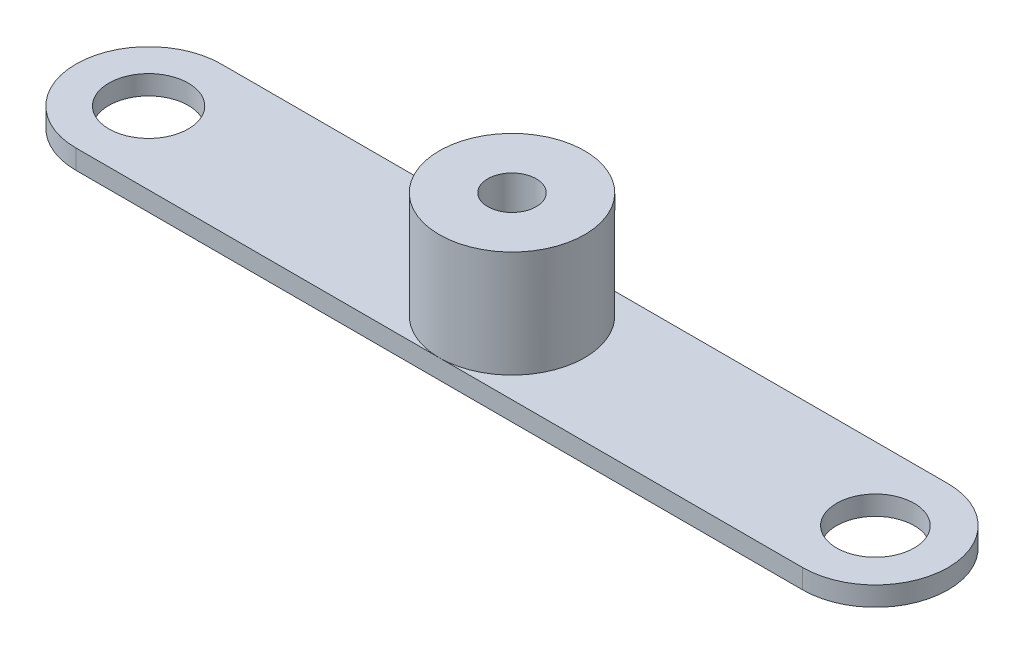
ISO-10303-21;
HEADER;
FILE_DESCRIPTION(('STEP AP214'),'2;1');
FILE_NAME('part.step','',(''),(''),'','','');
FILE_SCHEMA(('AUTOMOTIVE_DESIGN { 1 0 10303 214 1 1 1 1 }'));
ENDSEC;
DATA;
#1=APPLICATION_CONTEXT('core data for automotive mechanical design processes');
#2=APPLICATION_PROTOCOL_DEFINITION('international standard','automotive_design',2000,#1);
#3=PRODUCT_CONTEXT('',#1,'mechanical');
#4=PRODUCT('Part','Part','',(#3));
#5=PRODUCT_RELATED_PRODUCT_CATEGORY('part','',(#4));
#6=PRODUCT_DEFINITION_FORMATION('','',#4);
#7=PRODUCT_DEFINITION_CONTEXT('part definition',#1,'design');
#8=PRODUCT_DEFINITION('design','',#6,#7);
#9=PRODUCT_DEFINITION_SHAPE('','',#8);
#10=(LENGTH_UNIT() NAMED_UNIT(*) SI_UNIT(.MILLI.,.METRE.));
#11=(NAMED_UNIT(*) PLANE_ANGLE_UNIT() SI_UNIT($,.RADIAN.));
#12=(NAMED_UNIT(*) SI_UNIT($,.STERADIAN.) SOLID_ANGLE_UNIT());
#13=UNCERTAINTY_MEASURE_WITH_UNIT(LENGTH_MEASURE(1.E-05),#10,'distance_accuracy_value','');
#14=(GEOMETRIC_REPRESENTATION_CONTEXT(3) GLOBAL_UNCERTAINTY_ASSIGNED_CONTEXT((#13)) GLOBAL_UNIT_ASSIGNED_CONTEXT((#10,
#11,#12)) REPRESENTATION_CONTEXT('',''));
#15=CARTESIAN_POINT('',(0.,0.,0.));
#16=DIRECTION('',(0.,0.,1.));
#17=DIRECTION('',(1.,0.,0.));
#18=AXIS2_PLACEMENT_3D('',#15,#16,#17);
#19=CARTESIAN_POINT('',(-37.5,2.,0.));
#20=DIRECTION('',(0.,1.,0.));
#21=DIRECTION('',(0.,0.,1.));
#22=AXIS2_PLACEMENT_3D('',#19,#20,#21);
#23=PLANE('',#22);
#24=CARTESIAN_POINT('',(0.,2.,0.));
#25=DIRECTION('',(0.,1.,0.));
#26=DIRECTION('',(0.,0.,1.));
#27=AXIS2_PLACEMENT_3D('',#24,#25,#26);
#28=CIRCLE('',#27,7.50000000000001);
#29=CARTESIAN_POINT('',(0.,2.,7.50000000000001));
#30=VERTEX_POINT('',#29);
#31=CARTESIAN_POINT('',(0.,2.,-7.50000000000001));
#32=VERTEX_POINT('',#31);
#33=EDGE_CURVE('E49',#30,#32,#28,.T.);
#34=ORIENTED_EDGE('',*,*,#33,.F.);
#35=DIRECTION('',(1.,0.,0.));
#36=VECTOR('',#35,1.);
#37=CARTESIAN_POINT('',(-37.5,2.,7.5));
#38=LINE('',#37,#36);
#39=CARTESIAN_POINT('',(37.5,2.,7.5));
#40=VERTEX_POINT('',#39);
#41=EDGE_CURVE('E97',#30,#40,#38,.T.);
#42=ORIENTED_EDGE('',*,*,#41,.T.);
#43=CARTESIAN_POINT('',(37.5,2.,0.));
#44=DIRECTION('',(0.,1.,0.));
#45=DIRECTION('',(0.,0.,1.));
#46=AXIS2_PLACEMENT_3D('',#43,#44,#45);
#47=CIRCLE('',#46,7.5);
#48=CARTESIAN_POINT('',(37.5,2.,-7.50000000000001));
#49=VERTEX_POINT('',#48);
#50=EDGE_CURVE('E96',#40,#49,#47,.T.);
#51=ORIENTED_EDGE('',*,*,#50,.T.);
#52=DIRECTION('',(-1.,0.,0.));
#53=VECTOR('',#52,1.);
#54=CARTESIAN_POINT('',(-37.5,2.,-7.5));
#55=LINE('',#54,#53);
#56=EDGE_CURVE('E110',#49,#32,#55,.T.);
#57=ORIENTED_EDGE('',*,*,#56,.T.);
#58=EDGE_LOOP('',(#34,#42,#51,#57));
#59=FACE_BOUND('',#58,.T.);
#60=CARTESIAN_POINT('',(37.5,2.,0.));
#61=DIRECTION('',(0.,1.,0.));
#62=DIRECTION('',(0.,0.,1.));
#63=AXIS2_PLACEMENT_3D('',#60,#61,#62);
#64=CIRCLE('',#63,4.);
#65=CARTESIAN_POINT('',(37.5,2.,4.));
#66=VERTEX_POINT('',#65);
#67=EDGE_CURVE('E181',#66,#66,#64,.T.);
#68=ORIENTED_EDGE('',*,*,#67,.F.);
#69=EDGE_LOOP('',(#68));
#70=FACE_BOUND('',#69,.T.);
#71=ADVANCED_FACE('F39',(#59,#70),#23,.T.);
#72=EDGE_CURVE('E11',#32,#30,#28,.T.);
#73=ORIENTED_EDGE('',*,*,#72,.F.);
#74=CARTESIAN_POINT('',(-37.5,2.,-7.5));
#75=VERTEX_POINT('',#74);
#76=EDGE_CURVE('E59',#32,#75,#55,.T.);
#77=ORIENTED_EDGE('',*,*,#76,.T.);
#78=CARTESIAN_POINT('',(-37.5,2.,0.));
#79=DIRECTION('',(0.,1.,0.));
#80=DIRECTION('',(0.,0.,1.));
#81=AXIS2_PLACEMENT_3D('',#78,#79,#80);
#82=CIRCLE('',#81,7.5);
#83=CARTESIAN_POINT('',(-37.5,2.,7.5));
#84=VERTEX_POINT('',#83);
#85=EDGE_CURVE('E94',#75,#84,#82,.T.);
#86=ORIENTED_EDGE('',*,*,#85,.T.);
#87=EDGE_CURVE('E88',#84,#30,#38,.T.);
#88=ORIENTED_EDGE('',*,*,#87,.T.);
#89=EDGE_LOOP('',(#73,#77,#86,#88));
#90=FACE_BOUND('',#89,.T.);
#91=CARTESIAN_POINT('',(-37.5,2.,0.));
#92=DIRECTION('',(0.,1.,0.));
#93=DIRECTION('',(0.,0.,1.));
#94=AXIS2_PLACEMENT_3D('',#91,#92,#93);
#95=CIRCLE('',#94,4.1);
#96=CARTESIAN_POINT('',(-37.5,2.,4.1));
#97=VERTEX_POINT('',#96);
#98=EDGE_CURVE('E161',#97,#97,#95,.T.);
#99=ORIENTED_EDGE('',*,*,#98,.F.);
#100=EDGE_LOOP('',(#99));
#101=FACE_BOUND('',#100,.T.);
#102=ADVANCED_FACE('F91',(#90,#101),#23,.T.);
#103=CARTESIAN_POINT('',(-37.5,0.,0.));
#104=DIRECTION('',(0.,1.,0.));
#105=DIRECTION('',(0.,0.,1.));
#106=AXIS2_PLACEMENT_3D('',#103,#104,#105);
#107=PLANE('',#106);
#108=CARTESIAN_POINT('',(0.,0.,0.));
#109=DIRECTION('',(0.,1.,0.));
#110=DIRECTION('',(0.,0.,1.));
#111=AXIS2_PLACEMENT_3D('',#108,#109,#110);
#112=CIRCLE('',#111,2.5);
#113=CARTESIAN_POINT('',(0.,0.,2.5));
#114=VERTEX_POINT('',#113);
#115=EDGE_CURVE('E113',#114,#114,#112,.T.);
#116=ORIENTED_EDGE('',*,*,#115,.T.);
#117=EDGE_LOOP('',(#116));
#118=FACE_BOUND('',#117,.T.);
#119=CARTESIAN_POINT('',(-37.5,0.,0.));
#120=DIRECTION('',(0.,1.,0.));
#121=DIRECTION('',(0.,0.,1.));
#122=AXIS2_PLACEMENT_3D('',#119,#120,#121);
#123=CIRCLE('',#122,7.5);
#124=CARTESIAN_POINT('',(-37.5,0.,-7.5));
#125=VERTEX_POINT('',#124);
#126=CARTESIAN_POINT('',(-37.5,0.,7.5));
#127=VERTEX_POINT('',#126);
#128=EDGE_CURVE('E157',#125,#127,#123,.T.);
#129=ORIENTED_EDGE('',*,*,#128,.F.);
#130=DIRECTION('',(-1.,0.,0.));
#131=VECTOR('',#130,1.);
#132=CARTESIAN_POINT('',(-37.5,0.,-7.5));
#133=LINE('',#132,#131);
#134=CARTESIAN_POINT('',(37.5,0.,-7.50000000000001));
#135=VERTEX_POINT('',#134);
#136=EDGE_CURVE('E81',#135,#125,#133,.T.);
#137=ORIENTED_EDGE('',*,*,#136,.F.);
#138=CARTESIAN_POINT('',(37.5,0.,0.));
#139=DIRECTION('',(0.,1.,0.));
#140=DIRECTION('',(0.,0.,1.));
#141=AXIS2_PLACEMENT_3D('',#138,#139,#140);
#142=CIRCLE('',#141,7.5);
#143=CARTESIAN_POINT('',(37.5,0.,7.5));
#144=VERTEX_POINT('',#143);
#145=EDGE_CURVE('E163',#144,#135,#142,.T.);
#146=ORIENTED_EDGE('',*,*,#145,.F.);
#147=DIRECTION('',(1.,0.,0.));
#148=VECTOR('',#147,1.);
#149=CARTESIAN_POINT('',(-37.5,0.,7.5));
#150=LINE('',#149,#148);
#151=EDGE_CURVE('E160',#127,#144,#150,.T.);
#152=ORIENTED_EDGE('',*,*,#151,.F.);
#153=EDGE_LOOP('',(#129,#137,#146,#152));
#154=FACE_BOUND('',#153,.T.);
#155=CARTESIAN_POINT('',(-37.5,0.,0.));
#156=DIRECTION('',(0.,1.,0.));
#157=DIRECTION('',(0.,0.,1.));
#158=AXIS2_PLACEMENT_3D('',#155,#156,#157);
#159=CIRCLE('',#158,4.1);
#160=CARTESIAN_POINT('',(-37.5,0.,4.1));
#161=VERTEX_POINT('',#160);
#162=EDGE_CURVE('E166',#161,#161,#159,.T.);
#163=ORIENTED_EDGE('',*,*,#162,.T.);
#164=EDGE_LOOP('',(#163));
#165=FACE_BOUND('',#164,.T.);
#166=CARTESIAN_POINT('',(37.5,0.,0.));
#167=DIRECTION('',(0.,1.,0.));
#168=DIRECTION('',(0.,0.,1.));
#169=AXIS2_PLACEMENT_3D('',#166,#167,#168);
#170=CIRCLE('',#169,4.);
#171=CARTESIAN_POINT('',(37.5,0.,4.));
#172=VERTEX_POINT('',#171);
#173=EDGE_CURVE('E183',#172,#172,#170,.T.);
#174=ORIENTED_EDGE('',*,*,#173,.T.);
#175=EDGE_LOOP('',(#174));
#176=FACE_BOUND('',#175,.T.);
#177=ADVANCED_FACE('F138',(#118,#154,#165,#176),#107,.F.);
#178=CARTESIAN_POINT('',(-37.5,2.,0.));
#179=DIRECTION('',(0.,-1.,0.));
#180=DIRECTION('',(0.,0.,-1.));
#181=AXIS2_PLACEMENT_3D('',#178,#179,#180);
#182=CYLINDRICAL_SURFACE('',#181,7.5);
#183=ORIENTED_EDGE('',*,*,#128,.T.);
#184=DIRECTION('',(0.,-1.,0.));
#185=VECTOR('',#184,1.);
#186=CARTESIAN_POINT('',(-37.5,2.,7.5));
#187=LINE('',#186,#185);
#188=EDGE_CURVE('E43',#84,#127,#187,.T.);
#189=ORIENTED_EDGE('',*,*,#188,.F.);
#190=ORIENTED_EDGE('',*,*,#85,.F.);
#191=DIRECTION('',(0.,-1.,0.));
#192=VECTOR('',#191,1.);
#193=CARTESIAN_POINT('',(-37.5,2.,-7.5));
#194=LINE('',#193,#192);
#195=EDGE_CURVE('E158',#75,#125,#194,.T.);
#196=ORIENTED_EDGE('',*,*,#195,.T.);
#197=EDGE_LOOP('',(#183,#189,#190,#196));
#198=FACE_BOUND('',#197,.T.);
#199=ADVANCED_FACE('F41',(#198),#182,.T.);
#200=CARTESIAN_POINT('',(-37.5,2.,7.5));
#201=DIRECTION('',(0.,0.,-1.));
#202=DIRECTION('',(-1.,0.,0.));
#203=AXIS2_PLACEMENT_3D('',#200,#201,#202);
#204=PLANE('',#203);
#205=ORIENTED_EDGE('',*,*,#151,.T.);
#206=DIRECTION('',(0.,-1.,0.));
#207=VECTOR('',#206,1.);
#208=CARTESIAN_POINT('',(37.5,2.,7.5));
#209=LINE('',#208,#207);
#210=EDGE_CURVE('E103',#40,#144,#209,.T.);
#211=ORIENTED_EDGE('',*,*,#210,.F.);
#212=ORIENTED_EDGE('',*,*,#41,.F.);
#213=ORIENTED_EDGE('',*,*,#87,.F.);
#214=ORIENTED_EDGE('',*,*,#188,.T.);
#215=EDGE_LOOP('',(#205,#211,#212,#213,#214));
#216=FACE_BOUND('',#215,.T.);
#217=ADVANCED_FACE('F101',(#216),#204,.F.);
#218=CARTESIAN_POINT('',(37.5,2.,0.));
#219=DIRECTION('',(0.,-1.,0.));
#220=DIRECTION('',(0.,0.,-1.));
#221=AXIS2_PLACEMENT_3D('',#218,#219,#220);
#222=CYLINDRICAL_SURFACE('',#221,7.5);
#223=ORIENTED_EDGE('',*,*,#145,.T.);
#224=DIRECTION('',(0.,-1.,0.));
#225=VECTOR('',#224,1.);
#226=CARTESIAN_POINT('',(37.5,2.,-7.50000000000001));
#227=LINE('',#226,#225);
#228=EDGE_CURVE('E174',#49,#135,#227,.T.);
#229=ORIENTED_EDGE('',*,*,#228,.F.);
#230=ORIENTED_EDGE('',*,*,#50,.F.);
#231=ORIENTED_EDGE('',*,*,#210,.T.);
#232=EDGE_LOOP('',(#223,#229,#230,#231));
#233=FACE_BOUND('',#232,.T.);
#234=ADVANCED_FACE('F145',(#233),#222,.T.);
#235=CARTESIAN_POINT('',(-37.5,2.,-7.5));
#236=DIRECTION('',(0.,0.,1.));
#237=DIRECTION('',(1.,0.,0.));
#238=AXIS2_PLACEMENT_3D('',#235,#236,#237);
#239=PLANE('',#238);
#240=ORIENTED_EDGE('',*,*,#136,.T.);
#241=ORIENTED_EDGE('',*,*,#195,.F.);
#242=ORIENTED_EDGE('',*,*,#76,.F.);
#243=ORIENTED_EDGE('',*,*,#56,.F.);
#244=ORIENTED_EDGE('',*,*,#228,.T.);
#245=EDGE_LOOP('',(#240,#241,#242,#243,#244));
#246=FACE_BOUND('',#245,.T.);
#247=ADVANCED_FACE('F143',(#246),#239,.F.);
#248=CARTESIAN_POINT('',(-37.5,2.,0.));
#249=DIRECTION('',(0.,-1.,0.));
#250=DIRECTION('',(0.,0.,-1.));
#251=AXIS2_PLACEMENT_3D('',#248,#249,#250);
#252=CYLINDRICAL_SURFACE('',#251,4.1);
#253=ORIENTED_EDGE('',*,*,#98,.T.);
#254=EDGE_LOOP('',(#253));
#255=FACE_BOUND('',#254,.T.);
#256=ORIENTED_EDGE('',*,*,#162,.F.);
#257=EDGE_LOOP('',(#256));
#258=FACE_BOUND('',#257,.T.);
#259=ADVANCED_FACE('F129',(#255,#258),#252,.F.);
#260=CARTESIAN_POINT('',(37.5,2.,0.));
#261=DIRECTION('',(0.,-1.,0.));
#262=DIRECTION('',(0.,0.,-1.));
#263=AXIS2_PLACEMENT_3D('',#260,#261,#262);
#264=CYLINDRICAL_SURFACE('',#263,4.);
#265=ORIENTED_EDGE('',*,*,#67,.T.);
#266=EDGE_LOOP('',(#265));
#267=FACE_BOUND('',#266,.T.);
#268=ORIENTED_EDGE('',*,*,#173,.F.);
#269=EDGE_LOOP('',(#268));
#270=FACE_BOUND('',#269,.T.);
#271=ADVANCED_FACE('F117',(#267,#270),#264,.F.);
#272=CARTESIAN_POINT('',(0.,13.,0.));
#273=DIRECTION('',(0.,-1.,0.));
#274=DIRECTION('',(0.,0.,-1.));
#275=AXIS2_PLACEMENT_3D('',#272,#273,#274);
#276=CYLINDRICAL_SURFACE('',#275,7.50000000000001);
#277=CARTESIAN_POINT('',(0.,13.,0.));
#278=DIRECTION('',(0.,1.,0.));
#279=DIRECTION('',(0.,0.,1.));
#280=AXIS2_PLACEMENT_3D('',#277,#278,#279);
#281=CIRCLE('',#280,7.50000000000001);
#282=CARTESIAN_POINT('',(0.,13.,7.50000000000001));
#283=VERTEX_POINT('',#282);
#284=EDGE_CURVE('E112',#283,#283,#281,.T.);
#285=ORIENTED_EDGE('',*,*,#284,.F.);
#286=EDGE_LOOP('',(#285));
#287=FACE_BOUND('',#286,.T.);
#288=ORIENTED_EDGE('',*,*,#33,.T.);
#289=ORIENTED_EDGE('',*,*,#72,.T.);
#290=EDGE_LOOP('',(#288,#289));
#291=FACE_BOUND('',#290,.T.);
#292=ADVANCED_FACE('F114',(#287,#291),#276,.T.);
#293=CARTESIAN_POINT('',(0.,13.,0.));
#294=DIRECTION('',(0.,1.,0.));
#295=DIRECTION('',(0.,0.,1.));
#296=AXIS2_PLACEMENT_3D('',#293,#294,#295);
#297=PLANE('',#296);
#298=CARTESIAN_POINT('',(0.,13.,0.));
#299=DIRECTION('',(0.,1.,0.));
#300=DIRECTION('',(0.,0.,1.));
#301=AXIS2_PLACEMENT_3D('',#298,#299,#300);
#302=CIRCLE('',#301,2.5);
#303=CARTESIAN_POINT('',(0.,13.,2.5));
#304=VERTEX_POINT('',#303);
#305=EDGE_CURVE('E190',#304,#304,#302,.T.);
#306=ORIENTED_EDGE('',*,*,#305,.F.);
#307=EDGE_LOOP('',(#306));
#308=FACE_BOUND('',#307,.T.);
#309=ORIENTED_EDGE('',*,*,#284,.T.);
#310=EDGE_LOOP('',(#309));
#311=FACE_BOUND('',#310,.T.);
#312=ADVANCED_FACE('F116',(#308,#311),#297,.T.);
#313=CARTESIAN_POINT('',(0.,0.,0.));
#314=DIRECTION('',(0.,1.,0.));
#315=DIRECTION('',(0.,0.,1.));
#316=AXIS2_PLACEMENT_3D('',#313,#314,#315);
#317=CYLINDRICAL_SURFACE('',#316,2.5);
#318=CARTESIAN_POINT('',(0.,0.,2.5));
#319=CARTESIAN_POINT('',(0.,0.135416666666666,2.5));
#320=CARTESIAN_POINT('',(0.,0.270833333333333,2.5));
#321=CARTESIAN_POINT('',(0.,0.541666666666667,2.5));
#322=CARTESIAN_POINT('',(0.,0.677083333333333,2.5));
#323=CARTESIAN_POINT('',(0.,0.947916666666667,2.5));
#324=CARTESIAN_POINT('',(0.,1.08333333333333,2.5));
#325=CARTESIAN_POINT('',(0.,1.35416666666667,2.5));
#326=CARTESIAN_POINT('',(0.,1.48958333333333,2.5));
#327=CARTESIAN_POINT('',(0.,1.76041666666667,2.5));
#328=CARTESIAN_POINT('',(0.,1.89583333333333,2.5));
#329=CARTESIAN_POINT('',(0.,2.16666666666667,2.5));
#330=CARTESIAN_POINT('',(0.,2.30208333333333,2.5));
#331=CARTESIAN_POINT('',(0.,2.57291666666667,2.5));
#332=CARTESIAN_POINT('',(0.,2.70833333333333,2.5));
#333=CARTESIAN_POINT('',(0.,2.97916666666667,2.5));
#334=CARTESIAN_POINT('',(0.,3.11458333333333,2.5));
#335=CARTESIAN_POINT('',(0.,3.38541666666667,2.5));
#336=CARTESIAN_POINT('',(0.,3.52083333333333,2.5));
#337=CARTESIAN_POINT('',(0.,3.79166666666667,2.5));
#338=CARTESIAN_POINT('',(0.,3.92708333333333,2.5));
#339=CARTESIAN_POINT('',(0.,4.19791666666667,2.5));
#340=CARTESIAN_POINT('',(0.,4.33333333333333,2.5));
#341=CARTESIAN_POINT('',(0.,4.60416666666667,2.5));
#342=CARTESIAN_POINT('',(0.,4.73958333333333,2.5));
#343=CARTESIAN_POINT('',(0.,5.01041666666667,2.5));
#344=CARTESIAN_POINT('',(0.,5.14583333333333,2.5));
#345=CARTESIAN_POINT('',(0.,5.41666666666667,2.5));
#346=CARTESIAN_POINT('',(0.,5.55208333333333,2.5));
#347=CARTESIAN_POINT('',(0.,5.82291666666667,2.5));
#348=CARTESIAN_POINT('',(0.,5.95833333333333,2.5));
#349=CARTESIAN_POINT('',(0.,6.22916666666667,2.5));
#350=CARTESIAN_POINT('',(0.,6.36458333333333,2.5));
#351=CARTESIAN_POINT('',(0.,6.63541666666667,2.5));
#352=CARTESIAN_POINT('',(0.,6.77083333333333,2.5));
#353=CARTESIAN_POINT('',(0.,7.04166666666667,2.5));
#354=CARTESIAN_POINT('',(0.,7.17708333333333,2.5));
#355=CARTESIAN_POINT('',(0.,7.44791666666667,2.5));
#356=CARTESIAN_POINT('',(0.,7.58333333333333,2.5));
#357=CARTESIAN_POINT('',(0.,7.85416666666667,2.5));
#358=CARTESIAN_POINT('',(0.,7.98958333333333,2.5));
#359=CARTESIAN_POINT('',(0.,8.26041666666667,2.5));
#360=CARTESIAN_POINT('',(0.,8.39583333333333,2.5));
#361=CARTESIAN_POINT('',(0.,8.66666666666667,2.5));
#362=CARTESIAN_POINT('',(0.,8.80208333333333,2.5));
#363=CARTESIAN_POINT('',(0.,9.07291666666667,2.5));
#364=CARTESIAN_POINT('',(0.,9.20833333333333,2.5));
#365=CARTESIAN_POINT('',(0.,9.47916666666667,2.5));
#366=CARTESIAN_POINT('',(0.,9.61458333333333,2.5));
#367=CARTESIAN_POINT('',(0.,9.88541666666667,2.5));
#368=CARTESIAN_POINT('',(0.,10.0208333333333,2.5));
#369=CARTESIAN_POINT('',(0.,10.2916666666667,2.5));
#370=CARTESIAN_POINT('',(0.,10.4270833333333,2.5));
#371=CARTESIAN_POINT('',(0.,10.6979166666667,2.5));
#372=CARTESIAN_POINT('',(0.,10.8333333333333,2.5));
#373=CARTESIAN_POINT('',(0.,11.1041666666667,2.5));
#374=CARTESIAN_POINT('',(0.,11.2395833333333,2.5));
#375=CARTESIAN_POINT('',(0.,11.5104166666667,2.5));
#376=CARTESIAN_POINT('',(0.,11.6458333333333,2.5));
#377=CARTESIAN_POINT('',(0.,11.9166666666667,2.5));
#378=CARTESIAN_POINT('',(0.,12.0520833333333,2.5));
#379=CARTESIAN_POINT('',(0.,12.3229166666667,2.5));
#380=CARTESIAN_POINT('',(0.,12.4583333333333,2.5));
#381=CARTESIAN_POINT('',(0.,12.7291666666667,2.5));
#382=CARTESIAN_POINT('',(0.,12.8645833333333,2.5));
#383=CARTESIAN_POINT('',(0.,13.,2.5));
#384=B_SPLINE_CURVE_WITH_KNOTS('',3,(#318,#319,#320,#321,#322,#323,#324,#325,#326,#327,#328,
#329,#330,#331,#332,#333,#334,#335,#336,#337,#338,#339,#340,#341,#342,#343,#344,#345,#346,#347,
#348,#349,#350,#351,#352,#353,#354,#355,#356,#357,#358,#359,#360,#361,#362,#363,#364,#365,#366,
#367,#368,#369,#370,#371,#372,#373,#374,#375,#376,#377,#378,#379,#380,#381,#382,#383),
.UNSPECIFIED.,.F.,.F.,(4,2,2,2,2,2,2,2,2,2,2,2,2,2,2,2,2,2,2,2,2,2,2,2,2,2,2,2,2,2,2,2,4),(0.,
0.40625,0.8125,1.21875,1.625,2.03125,2.4375,2.84375,3.25,3.65625,4.0625,4.46875,4.875,5.28125,
5.6875,6.09375,6.5,6.90625,7.3125,7.71875,8.125,8.53125,8.9375,9.34375,9.75,10.15625,10.5625,
10.96875,11.375,11.78125,12.1875,12.59375,13.),.UNSPECIFIED.);
#385=EDGE_CURVE('BSEAM125',#114,#304,#384,.T.);
#386=ORIENTED_EDGE('',*,*,#115,.F.);
#387=ORIENTED_EDGE('',*,*,#305,.T.);
#388=ORIENTED_EDGE('',*,*,#385,.T.);
#389=ORIENTED_EDGE('',*,*,#385,.F.);
#390=EDGE_LOOP('',(#386,#388,#387,#389));
#391=FACE_BOUND('',#390,.T.);
#392=ADVANCED_FACE('F125',(#391),#317,.F.);
#393=CLOSED_SHELL('',(#71,#102,#177,#199,#217,#234,#247,#259,#271,#292,#312,#392));
#394=MANIFOLD_SOLID_BREP('B2',#393);
#395=ADVANCED_BREP_SHAPE_REPRESENTATION('',(#18,#394),#14);
#396=SHAPE_DEFINITION_REPRESENTATION(#9,#395);
ENDSEC;
END-ISO-10303-21;
